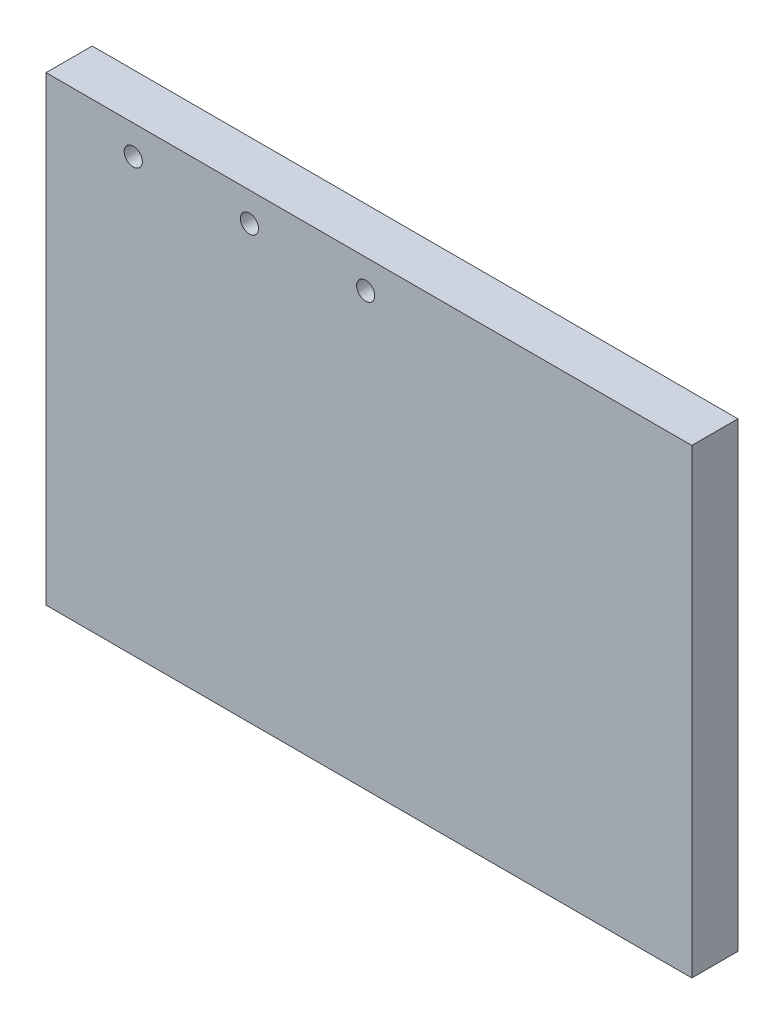
ISO-10303-21;
HEADER;
FILE_DESCRIPTION(('STEP AP214'),'2;1');
FILE_NAME('part.step','',(''),(''),'','','');
FILE_SCHEMA(('AUTOMOTIVE_DESIGN { 1 0 10303 214 1 1 1 1 }'));
ENDSEC;
DATA;
#1=APPLICATION_CONTEXT('core data for automotive mechanical design processes');
#2=APPLICATION_PROTOCOL_DEFINITION('international standard','automotive_design',2000,#1);
#3=PRODUCT_CONTEXT('',#1,'mechanical');
#4=PRODUCT('Part','Part','',(#3));
#5=PRODUCT_RELATED_PRODUCT_CATEGORY('part','',(#4));
#6=PRODUCT_DEFINITION_FORMATION('','',#4);
#7=PRODUCT_DEFINITION_CONTEXT('part definition',#1,'design');
#8=PRODUCT_DEFINITION('design','',#6,#7);
#9=PRODUCT_DEFINITION_SHAPE('','',#8);
#10=(LENGTH_UNIT() NAMED_UNIT(*) SI_UNIT(.MILLI.,.METRE.));
#11=(NAMED_UNIT(*) PLANE_ANGLE_UNIT() SI_UNIT($,.RADIAN.));
#12=(NAMED_UNIT(*) SI_UNIT($,.STERADIAN.) SOLID_ANGLE_UNIT());
#13=UNCERTAINTY_MEASURE_WITH_UNIT(LENGTH_MEASURE(1.E-05),#10,'distance_accuracy_value','');
#14=(GEOMETRIC_REPRESENTATION_CONTEXT(3) GLOBAL_UNCERTAINTY_ASSIGNED_CONTEXT((#13)) GLOBAL_UNIT_ASSIGNED_CONTEXT((#10,
#11,#12)) REPRESENTATION_CONTEXT('',''));
#15=CARTESIAN_POINT('',(0.,0.,0.));
#16=DIRECTION('',(0.,0.,1.));
#17=DIRECTION('',(1.,0.,0.));
#18=AXIS2_PLACEMENT_3D('',#15,#16,#17);
#19=CARTESIAN_POINT('',(44.45,0.,6.35));
#20=DIRECTION('',(1.,0.,0.));
#21=DIRECTION('',(0.,1.,0.));
#22=AXIS2_PLACEMENT_3D('',#19,#20,#21);
#23=PLANE('',#22);
#24=DIRECTION('',(0.,-1.,0.));
#25=VECTOR('',#24,1.);
#26=CARTESIAN_POINT('',(44.45,0.,0.));
#27=LINE('',#26,#25);
#28=CARTESIAN_POINT('',(44.45,31.75,0.));
#29=VERTEX_POINT('',#28);
#30=CARTESIAN_POINT('',(44.45,-31.75,0.));
#31=VERTEX_POINT('',#30);
#32=EDGE_CURVE('E123',#29,#31,#27,.T.);
#33=ORIENTED_EDGE('',*,*,#32,.F.);
#34=DIRECTION('',(0.,0.,-1.));
#35=VECTOR('',#34,1.);
#36=CARTESIAN_POINT('',(44.45,31.75,6.35));
#37=LINE('',#36,#35);
#38=CARTESIAN_POINT('',(44.45,31.75,6.35));
#39=VERTEX_POINT('',#38);
#40=EDGE_CURVE('E11',#39,#29,#37,.T.);
#41=ORIENTED_EDGE('',*,*,#40,.F.);
#42=DIRECTION('',(0.,-1.,0.));
#43=VECTOR('',#42,1.);
#44=CARTESIAN_POINT('',(44.45,0.,6.35));
#45=LINE('',#44,#43);
#46=CARTESIAN_POINT('',(44.45,-31.75,6.35));
#47=VERTEX_POINT('',#46);
#48=EDGE_CURVE('E113',#39,#47,#45,.T.);
#49=ORIENTED_EDGE('',*,*,#48,.T.);
#50=DIRECTION('',(0.,0.,-1.));
#51=VECTOR('',#50,1.);
#52=CARTESIAN_POINT('',(44.45,-31.75,6.35));
#53=LINE('',#52,#51);
#54=EDGE_CURVE('E95',#47,#31,#53,.T.);
#55=ORIENTED_EDGE('',*,*,#54,.T.);
#56=EDGE_LOOP('',(#33,#41,#49,#55));
#57=FACE_BOUND('',#56,.T.);
#58=ADVANCED_FACE('F52',(#57),#23,.T.);
#59=CARTESIAN_POINT('',(0.,31.75,6.35));
#60=DIRECTION('',(0.,1.,0.));
#61=DIRECTION('',(0.,0.,1.));
#62=AXIS2_PLACEMENT_3D('',#59,#60,#61);
#63=PLANE('',#62);
#64=DIRECTION('',(1.,0.,0.));
#65=VECTOR('',#64,1.);
#66=CARTESIAN_POINT('',(0.,31.75,0.));
#67=LINE('',#66,#65);
#68=CARTESIAN_POINT('',(-44.45,31.75,0.));
#69=VERTEX_POINT('',#68);
#70=EDGE_CURVE('E102',#69,#29,#67,.T.);
#71=ORIENTED_EDGE('',*,*,#70,.F.);
#72=DIRECTION('',(0.,0.,-1.));
#73=VECTOR('',#72,1.);
#74=CARTESIAN_POINT('',(-44.45,31.75,6.35));
#75=LINE('',#74,#73);
#76=CARTESIAN_POINT('',(-44.45,31.75,6.35));
#77=VERTEX_POINT('',#76);
#78=EDGE_CURVE('E65',#77,#69,#75,.T.);
#79=ORIENTED_EDGE('',*,*,#78,.F.);
#80=DIRECTION('',(1.,0.,0.));
#81=VECTOR('',#80,1.);
#82=CARTESIAN_POINT('',(0.,31.75,6.35));
#83=LINE('',#82,#81);
#84=EDGE_CURVE('E101',#77,#39,#83,.T.);
#85=ORIENTED_EDGE('',*,*,#84,.T.);
#86=ORIENTED_EDGE('',*,*,#40,.T.);
#87=EDGE_LOOP('',(#71,#79,#85,#86));
#88=FACE_BOUND('',#87,.T.);
#89=ADVANCED_FACE('F103',(#88),#63,.T.);
#90=CARTESIAN_POINT('',(-44.45,0.,6.35));
#91=DIRECTION('',(1.,0.,0.));
#92=DIRECTION('',(0.,1.,0.));
#93=AXIS2_PLACEMENT_3D('',#90,#91,#92);
#94=PLANE('',#93);
#95=DIRECTION('',(0.,-1.,0.));
#96=VECTOR('',#95,1.);
#97=CARTESIAN_POINT('',(-44.45,0.,0.));
#98=LINE('',#97,#96);
#99=CARTESIAN_POINT('',(-44.45,-31.75,0.));
#100=VERTEX_POINT('',#99);
#101=EDGE_CURVE('E84',#69,#100,#98,.T.);
#102=ORIENTED_EDGE('',*,*,#101,.T.);
#103=DIRECTION('',(0.,0.,-1.));
#104=VECTOR('',#103,1.);
#105=CARTESIAN_POINT('',(-44.45,-31.75,6.35));
#106=LINE('',#105,#104);
#107=CARTESIAN_POINT('',(-44.45,-31.75,6.35));
#108=VERTEX_POINT('',#107);
#109=EDGE_CURVE('E110',#108,#100,#106,.T.);
#110=ORIENTED_EDGE('',*,*,#109,.F.);
#111=DIRECTION('',(0.,-1.,0.));
#112=VECTOR('',#111,1.);
#113=CARTESIAN_POINT('',(-44.45,0.,6.35));
#114=LINE('',#113,#112);
#115=EDGE_CURVE('E108',#77,#108,#114,.T.);
#116=ORIENTED_EDGE('',*,*,#115,.F.);
#117=ORIENTED_EDGE('',*,*,#78,.T.);
#118=EDGE_LOOP('',(#102,#110,#116,#117));
#119=FACE_BOUND('',#118,.T.);
#120=ADVANCED_FACE('F107',(#119),#94,.F.);
#121=CARTESIAN_POINT('',(0.,-31.75,6.35));
#122=DIRECTION('',(0.,1.,0.));
#123=DIRECTION('',(0.,0.,1.));
#124=AXIS2_PLACEMENT_3D('',#121,#122,#123);
#125=PLANE('',#124);
#126=DIRECTION('',(1.,0.,0.));
#127=VECTOR('',#126,1.);
#128=CARTESIAN_POINT('',(0.,-31.75,0.));
#129=LINE('',#128,#127);
#130=EDGE_CURVE('E118',#100,#31,#129,.T.);
#131=ORIENTED_EDGE('',*,*,#130,.T.);
#132=ORIENTED_EDGE('',*,*,#54,.F.);
#133=DIRECTION('',(1.,0.,0.));
#134=VECTOR('',#133,1.);
#135=CARTESIAN_POINT('',(0.,-31.75,6.35));
#136=LINE('',#135,#134);
#137=EDGE_CURVE('E68',#108,#47,#136,.T.);
#138=ORIENTED_EDGE('',*,*,#137,.F.);
#139=ORIENTED_EDGE('',*,*,#109,.T.);
#140=EDGE_LOOP('',(#131,#132,#138,#139));
#141=FACE_BOUND('',#140,.T.);
#142=ADVANCED_FACE('F141',(#141),#125,.F.);
#143=CARTESIAN_POINT('',(0.,0.,6.35));
#144=DIRECTION('',(0.,0.,1.));
#145=DIRECTION('',(1.,0.,0.));
#146=AXIS2_PLACEMENT_3D('',#143,#144,#145);
#147=PLANE('',#146);
#148=CARTESIAN_POINT('',(-0.449999999999992,27.749999872,6.35));
#149=DIRECTION('',(0.,0.,-1.));
#150=DIRECTION('',(-1.,0.,0.));
#151=AXIS2_PLACEMENT_3D('',#148,#149,#150);
#152=CIRCLE('',#151,1.25);
#153=CARTESIAN_POINT('',(-1.69999999999999,27.749999872,6.35));
#154=VERTEX_POINT('',#153);
#155=EDGE_CURVE('E128',#154,#154,#152,.T.);
#156=ORIENTED_EDGE('',*,*,#155,.T.);
#157=EDGE_LOOP('',(#156));
#158=FACE_BOUND('',#157,.T.);
#159=CARTESIAN_POINT('',(-32.45,27.749999872,6.35));
#160=DIRECTION('',(0.,0.,-1.));
#161=DIRECTION('',(-1.,0.,0.));
#162=AXIS2_PLACEMENT_3D('',#159,#160,#161);
#163=CIRCLE('',#162,1.25);
#164=CARTESIAN_POINT('',(-33.7,27.749999872,6.35));
#165=VERTEX_POINT('',#164);
#166=EDGE_CURVE('E182',#165,#165,#163,.T.);
#167=ORIENTED_EDGE('',*,*,#166,.T.);
#168=EDGE_LOOP('',(#167));
#169=FACE_BOUND('',#168,.T.);
#170=CARTESIAN_POINT('',(-16.45,27.749999872,6.35));
#171=DIRECTION('',(0.,0.,-1.));
#172=DIRECTION('',(-1.,0.,0.));
#173=AXIS2_PLACEMENT_3D('',#170,#171,#172);
#174=CIRCLE('',#173,1.25);
#175=CARTESIAN_POINT('',(-17.7,27.749999872,6.35));
#176=VERTEX_POINT('',#175);
#177=EDGE_CURVE('E199',#176,#176,#174,.T.);
#178=ORIENTED_EDGE('',*,*,#177,.T.);
#179=EDGE_LOOP('',(#178));
#180=FACE_BOUND('',#179,.T.);
#181=ORIENTED_EDGE('',*,*,#48,.F.);
#182=ORIENTED_EDGE('',*,*,#84,.F.);
#183=ORIENTED_EDGE('',*,*,#115,.T.);
#184=ORIENTED_EDGE('',*,*,#137,.T.);
#185=EDGE_LOOP('',(#181,#182,#183,#184));
#186=FACE_BOUND('',#185,.T.);
#187=ADVANCED_FACE('F115',(#158,#169,#180,#186),#147,.T.);
#188=CARTESIAN_POINT('',(0.,0.,0.));
#189=DIRECTION('',(0.,0.,1.));
#190=DIRECTION('',(1.,0.,0.));
#191=AXIS2_PLACEMENT_3D('',#188,#189,#190);
#192=PLANE('',#191);
#193=CARTESIAN_POINT('',(-0.449999999999992,27.749999872,0.));
#194=DIRECTION('',(0.,0.,-1.));
#195=DIRECTION('',(-1.,0.,0.));
#196=AXIS2_PLACEMENT_3D('',#193,#194,#195);
#197=CIRCLE('',#196,1.25);
#198=CARTESIAN_POINT('',(-1.69999999999999,27.749999872,0.));
#199=VERTEX_POINT('',#198);
#200=EDGE_CURVE('E181',#199,#199,#197,.T.);
#201=ORIENTED_EDGE('',*,*,#200,.F.);
#202=EDGE_LOOP('',(#201));
#203=FACE_BOUND('',#202,.T.);
#204=CARTESIAN_POINT('',(-32.45,27.749999872,0.));
#205=DIRECTION('',(0.,0.,-1.));
#206=DIRECTION('',(-1.,0.,0.));
#207=AXIS2_PLACEMENT_3D('',#204,#205,#206);
#208=CIRCLE('',#207,1.25);
#209=CARTESIAN_POINT('',(-33.7,27.749999872,0.));
#210=VERTEX_POINT('',#209);
#211=EDGE_CURVE('E191',#210,#210,#208,.T.);
#212=ORIENTED_EDGE('',*,*,#211,.F.);
#213=EDGE_LOOP('',(#212));
#214=FACE_BOUND('',#213,.T.);
#215=CARTESIAN_POINT('',(-16.45,27.749999872,0.));
#216=DIRECTION('',(0.,0.,-1.));
#217=DIRECTION('',(-1.,0.,0.));
#218=AXIS2_PLACEMENT_3D('',#215,#216,#217);
#219=CIRCLE('',#218,1.25);
#220=CARTESIAN_POINT('',(-17.7,27.749999872,0.));
#221=VERTEX_POINT('',#220);
#222=EDGE_CURVE('E198',#221,#221,#219,.T.);
#223=ORIENTED_EDGE('',*,*,#222,.F.);
#224=EDGE_LOOP('',(#223));
#225=FACE_BOUND('',#224,.T.);
#226=ORIENTED_EDGE('',*,*,#32,.T.);
#227=ORIENTED_EDGE('',*,*,#130,.F.);
#228=ORIENTED_EDGE('',*,*,#101,.F.);
#229=ORIENTED_EDGE('',*,*,#70,.T.);
#230=EDGE_LOOP('',(#226,#227,#228,#229));
#231=FACE_BOUND('',#230,.T.);
#232=ADVANCED_FACE('F143',(#203,#214,#225,#231),#192,.F.);
#233=CARTESIAN_POINT('',(-16.45,27.749999872,6.35));
#234=DIRECTION('',(0.,0.,-1.));
#235=DIRECTION('',(-1.,0.,0.));
#236=AXIS2_PLACEMENT_3D('',#233,#234,#235);
#237=CYLINDRICAL_SURFACE('',#236,1.25);
#238=ORIENTED_EDGE('',*,*,#177,.F.);
#239=EDGE_LOOP('',(#238));
#240=FACE_BOUND('',#239,.T.);
#241=ORIENTED_EDGE('',*,*,#222,.T.);
#242=EDGE_LOOP('',(#241));
#243=FACE_BOUND('',#242,.T.);
#244=ADVANCED_FACE('F159',(#240,#243),#237,.F.);
#245=CARTESIAN_POINT('',(-32.45,27.749999872,6.35));
#246=DIRECTION('',(0.,0.,-1.));
#247=DIRECTION('',(-1.,0.,0.));
#248=AXIS2_PLACEMENT_3D('',#245,#246,#247);
#249=CYLINDRICAL_SURFACE('',#248,1.25);
#250=ORIENTED_EDGE('',*,*,#166,.F.);
#251=EDGE_LOOP('',(#250));
#252=FACE_BOUND('',#251,.T.);
#253=ORIENTED_EDGE('',*,*,#211,.T.);
#254=EDGE_LOOP('',(#253));
#255=FACE_BOUND('',#254,.T.);
#256=ADVANCED_FACE('F168',(#252,#255),#249,.F.);
#257=CARTESIAN_POINT('',(-0.449999999999992,27.749999872,6.35));
#258=DIRECTION('',(0.,0.,-1.));
#259=DIRECTION('',(-1.,0.,0.));
#260=AXIS2_PLACEMENT_3D('',#257,#258,#259);
#261=CYLINDRICAL_SURFACE('',#260,1.25);
#262=ORIENTED_EDGE('',*,*,#155,.F.);
#263=EDGE_LOOP('',(#262));
#264=FACE_BOUND('',#263,.T.);
#265=ORIENTED_EDGE('',*,*,#200,.T.);
#266=EDGE_LOOP('',(#265));
#267=FACE_BOUND('',#266,.T.);
#268=ADVANCED_FACE('F167',(#264,#267),#261,.F.);
#269=CLOSED_SHELL('',(#58,#89,#120,#142,#187,#232,#244,#256,#268));
#270=MANIFOLD_SOLID_BREP('B2',#269);
#271=ADVANCED_BREP_SHAPE_REPRESENTATION('',(#18,#270),#14);
#272=SHAPE_DEFINITION_REPRESENTATION(#9,#271);
ENDSEC;
END-ISO-10303-21;
